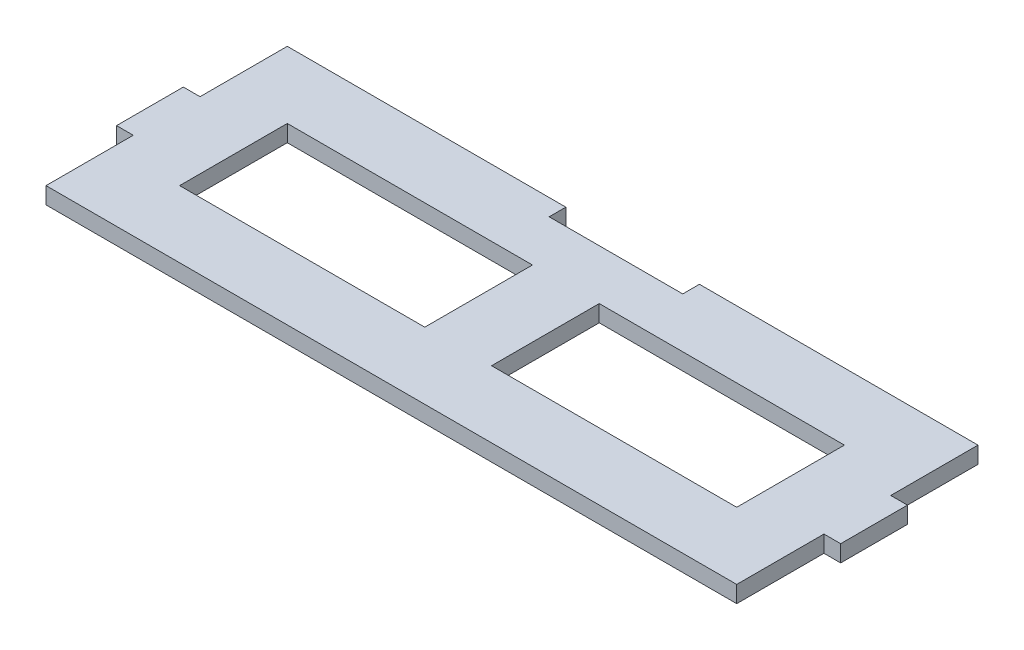
ISO-10303-21;
HEADER;
FILE_DESCRIPTION(('STEP AP214'),'2;1');
FILE_NAME('part.step','',(''),(''),'','','');
FILE_SCHEMA(('AUTOMOTIVE_DESIGN { 1 0 10303 214 1 1 1 1 }'));
ENDSEC;
DATA;
#1=APPLICATION_CONTEXT('core data for automotive mechanical design processes');
#2=APPLICATION_PROTOCOL_DEFINITION('international standard','automotive_design',2000,#1);
#3=PRODUCT_CONTEXT('',#1,'mechanical');
#4=PRODUCT('Part','Part','',(#3));
#5=PRODUCT_RELATED_PRODUCT_CATEGORY('part','',(#4));
#6=PRODUCT_DEFINITION_FORMATION('','',#4);
#7=PRODUCT_DEFINITION_CONTEXT('part definition',#1,'design');
#8=PRODUCT_DEFINITION('design','',#6,#7);
#9=PRODUCT_DEFINITION_SHAPE('','',#8);
#10=(LENGTH_UNIT() NAMED_UNIT(*) SI_UNIT(.MILLI.,.METRE.));
#11=(NAMED_UNIT(*) PLANE_ANGLE_UNIT() SI_UNIT($,.RADIAN.));
#12=(NAMED_UNIT(*) SI_UNIT($,.STERADIAN.) SOLID_ANGLE_UNIT());
#13=UNCERTAINTY_MEASURE_WITH_UNIT(LENGTH_MEASURE(1.E-05),#10,'distance_accuracy_value','');
#14=(GEOMETRIC_REPRESENTATION_CONTEXT(3) GLOBAL_UNCERTAINTY_ASSIGNED_CONTEXT((#13)) GLOBAL_UNIT_ASSIGNED_CONTEXT((#10,
#11,#12)) REPRESENTATION_CONTEXT('',''));
#15=CARTESIAN_POINT('',(0.,0.,0.));
#16=DIRECTION('',(0.,0.,1.));
#17=DIRECTION('',(1.,0.,0.));
#18=AXIS2_PLACEMENT_3D('',#15,#16,#17);
#19=CARTESIAN_POINT('',(0.,3.175,0.));
#20=DIRECTION('',(0.,-1.,0.));
#21=DIRECTION('',(0.,0.,-1.));
#22=AXIS2_PLACEMENT_3D('',#19,#20,#21);
#23=PLANE('',#22);
#24=DIRECTION('',(0.,0.,1.));
#25=VECTOR('',#24,1.);
#26=CARTESIAN_POINT('',(-52.959,3.175,-10.2362));
#27=LINE('',#26,#25);
#28=CARTESIAN_POINT('',(-52.959,3.175,-10.2362));
#29=VERTEX_POINT('',#28);
#30=CARTESIAN_POINT('',(-52.959,3.175,10.2362));
#31=VERTEX_POINT('',#30);
#32=EDGE_CURVE('E230',#29,#31,#27,.T.);
#33=ORIENTED_EDGE('',*,*,#32,.F.);
#34=DIRECTION('',(-1.,0.,0.));
#35=VECTOR('',#34,1.);
#36=CARTESIAN_POINT('',(-52.959,3.175,-10.2362));
#37=LINE('',#36,#35);
#38=CARTESIAN_POINT('',(-6.34999999999999,3.175,-10.2362));
#39=VERTEX_POINT('',#38);
#40=EDGE_CURVE('E238',#39,#29,#37,.T.);
#41=ORIENTED_EDGE('',*,*,#40,.F.);
#42=DIRECTION('',(0.,0.,-1.));
#43=VECTOR('',#42,1.);
#44=CARTESIAN_POINT('',(-6.34999999999999,3.175,-10.2362));
#45=LINE('',#44,#43);
#46=CARTESIAN_POINT('',(-6.34999999999999,3.175,10.2362));
#47=VERTEX_POINT('',#46);
#48=EDGE_CURVE('E235',#47,#39,#45,.T.);
#49=ORIENTED_EDGE('',*,*,#48,.F.);
#50=DIRECTION('',(1.,0.,0.));
#51=VECTOR('',#50,1.);
#52=CARTESIAN_POINT('',(-52.959,3.175,10.2362));
#53=LINE('',#52,#51);
#54=EDGE_CURVE('E232',#31,#47,#53,.T.);
#55=ORIENTED_EDGE('',*,*,#54,.F.);
#56=EDGE_LOOP('',(#33,#41,#49,#55));
#57=FACE_BOUND('',#56,.T.);
#58=DIRECTION('',(0.,0.,1.));
#59=VECTOR('',#58,1.);
#60=CARTESIAN_POINT('',(-65.659,3.175,-22.9362));
#61=LINE('',#60,#59);
#62=CARTESIAN_POINT('',(-65.659,3.175,-22.9362));
#63=VERTEX_POINT('',#62);
#64=CARTESIAN_POINT('',(-65.659,3.175,-6.35));
#65=VERTEX_POINT('',#64);
#66=EDGE_CURVE('E261',#63,#65,#61,.T.);
#67=ORIENTED_EDGE('',*,*,#66,.T.);
#68=DIRECTION('',(-1.,0.,0.));
#69=VECTOR('',#68,1.);
#70=CARTESIAN_POINT('',(-65.659,3.175,-6.35));
#71=LINE('',#70,#69);
#72=CARTESIAN_POINT('',(-68.834,3.175,-6.35));
#73=VERTEX_POINT('',#72);
#74=EDGE_CURVE('E264',#65,#73,#71,.T.);
#75=ORIENTED_EDGE('',*,*,#74,.T.);
#76=DIRECTION('',(0.,0.,1.));
#77=VECTOR('',#76,1.);
#78=CARTESIAN_POINT('',(-68.834,3.175,-6.35));
#79=LINE('',#78,#77);
#80=CARTESIAN_POINT('',(-68.834,3.175,6.35));
#81=VERTEX_POINT('',#80);
#82=EDGE_CURVE('E267',#73,#81,#79,.T.);
#83=ORIENTED_EDGE('',*,*,#82,.T.);
#84=DIRECTION('',(1.,0.,0.));
#85=VECTOR('',#84,1.);
#86=CARTESIAN_POINT('',(-68.834,3.175,6.35));
#87=LINE('',#86,#85);
#88=CARTESIAN_POINT('',(-65.659,3.175,6.35));
#89=VERTEX_POINT('',#88);
#90=EDGE_CURVE('E269',#81,#89,#87,.T.);
#91=ORIENTED_EDGE('',*,*,#90,.T.);
#92=DIRECTION('',(0.,0.,1.));
#93=VECTOR('',#92,1.);
#94=CARTESIAN_POINT('',(-65.659,3.175,6.35));
#95=LINE('',#94,#93);
#96=CARTESIAN_POINT('',(-65.659,3.175,22.9362));
#97=VERTEX_POINT('',#96);
#98=EDGE_CURVE('E271',#89,#97,#95,.T.);
#99=ORIENTED_EDGE('',*,*,#98,.T.);
#100=DIRECTION('',(1.,0.,0.));
#101=VECTOR('',#100,1.);
#102=CARTESIAN_POINT('',(-65.659,3.175,22.9362));
#103=LINE('',#102,#101);
#104=CARTESIAN_POINT('',(65.659,3.175,22.9362));
#105=VERTEX_POINT('',#104);
#106=EDGE_CURVE('E273',#97,#105,#103,.T.);
#107=ORIENTED_EDGE('',*,*,#106,.T.);
#108=DIRECTION('',(0.,0.,-1.));
#109=VECTOR('',#108,1.);
#110=CARTESIAN_POINT('',(65.659,3.175,6.35));
#111=LINE('',#110,#109);
#112=CARTESIAN_POINT('',(65.659,3.175,6.35));
#113=VERTEX_POINT('',#112);
#114=EDGE_CURVE('E275',#105,#113,#111,.T.);
#115=ORIENTED_EDGE('',*,*,#114,.T.);
#116=DIRECTION('',(1.,0.,0.));
#117=VECTOR('',#116,1.);
#118=CARTESIAN_POINT('',(68.834,3.175,6.35));
#119=LINE('',#118,#117);
#120=CARTESIAN_POINT('',(68.834,3.175,6.35));
#121=VERTEX_POINT('',#120);
#122=EDGE_CURVE('E277',#113,#121,#119,.T.);
#123=ORIENTED_EDGE('',*,*,#122,.T.);
#124=DIRECTION('',(0.,0.,-1.));
#125=VECTOR('',#124,1.);
#126=CARTESIAN_POINT('',(68.834,3.175,-6.35));
#127=LINE('',#126,#125);
#128=CARTESIAN_POINT('',(68.834,3.175,-6.35));
#129=VERTEX_POINT('',#128);
#130=EDGE_CURVE('E279',#121,#129,#127,.T.);
#131=ORIENTED_EDGE('',*,*,#130,.T.);
#132=DIRECTION('',(-1.,0.,0.));
#133=VECTOR('',#132,1.);
#134=CARTESIAN_POINT('',(65.659,3.175,-6.35));
#135=LINE('',#134,#133);
#136=CARTESIAN_POINT('',(65.659,3.175,-6.35));
#137=VERTEX_POINT('',#136);
#138=EDGE_CURVE('E281',#129,#137,#135,.T.);
#139=ORIENTED_EDGE('',*,*,#138,.T.);
#140=DIRECTION('',(0.,0.,-1.));
#141=VECTOR('',#140,1.);
#142=CARTESIAN_POINT('',(65.659,3.175,-22.9362));
#143=LINE('',#142,#141);
#144=CARTESIAN_POINT('',(65.659,3.175,-22.9362));
#145=VERTEX_POINT('',#144);
#146=EDGE_CURVE('E283',#137,#145,#143,.T.);
#147=ORIENTED_EDGE('',*,*,#146,.T.);
#148=DIRECTION('',(-1.,0.,0.));
#149=VECTOR('',#148,1.);
#150=CARTESIAN_POINT('',(12.7,3.175,-22.9362));
#151=LINE('',#150,#149);
#152=CARTESIAN_POINT('',(12.7,3.175,-22.9362));
#153=VERTEX_POINT('',#152);
#154=EDGE_CURVE('E285',#145,#153,#151,.T.);
#155=ORIENTED_EDGE('',*,*,#154,.T.);
#156=DIRECTION('',(0.,0.,1.));
#157=VECTOR('',#156,1.);
#158=CARTESIAN_POINT('',(12.7,3.175,-19.7612));
#159=LINE('',#158,#157);
#160=CARTESIAN_POINT('',(12.7,3.175,-19.7612));
#161=VERTEX_POINT('',#160);
#162=EDGE_CURVE('E287',#153,#161,#159,.T.);
#163=ORIENTED_EDGE('',*,*,#162,.T.);
#164=DIRECTION('',(-1.,0.,0.));
#165=VECTOR('',#164,1.);
#166=CARTESIAN_POINT('',(-12.7,3.175,-19.7612));
#167=LINE('',#166,#165);
#168=CARTESIAN_POINT('',(-12.7,3.175,-19.7612));
#169=VERTEX_POINT('',#168);
#170=EDGE_CURVE('E289',#161,#169,#167,.T.);
#171=ORIENTED_EDGE('',*,*,#170,.T.);
#172=DIRECTION('',(0.,0.,-1.));
#173=VECTOR('',#172,1.);
#174=CARTESIAN_POINT('',(-12.7,3.175,-22.9362));
#175=LINE('',#174,#173);
#176=CARTESIAN_POINT('',(-12.7,3.175,-22.9362));
#177=VERTEX_POINT('',#176);
#178=EDGE_CURVE('E291',#169,#177,#175,.T.);
#179=ORIENTED_EDGE('',*,*,#178,.T.);
#180=DIRECTION('',(-1.,0.,0.));
#181=VECTOR('',#180,1.);
#182=CARTESIAN_POINT('',(-65.659,3.175,-22.9362));
#183=LINE('',#182,#181);
#184=EDGE_CURVE('E293',#177,#63,#183,.T.);
#185=ORIENTED_EDGE('',*,*,#184,.T.);
#186=EDGE_LOOP('',(#67,#75,#83,#91,#99,#107,#115,#123,#131,#139,#147,#155,#163,#171,#179,#185));
#187=FACE_BOUND('',#186,.T.);
#188=DIRECTION('',(1.,0.,0.));
#189=VECTOR('',#188,1.);
#190=CARTESIAN_POINT('',(6.35000000000001,3.175,10.2362));
#191=LINE('',#190,#189);
#192=CARTESIAN_POINT('',(6.35000000000001,3.175,10.2362));
#193=VERTEX_POINT('',#192);
#194=CARTESIAN_POINT('',(52.959,3.175,10.2362));
#195=VERTEX_POINT('',#194);
#196=EDGE_CURVE('E194',#193,#195,#191,.T.);
#197=ORIENTED_EDGE('',*,*,#196,.F.);
#198=DIRECTION('',(0.,0.,1.));
#199=VECTOR('',#198,1.);
#200=CARTESIAN_POINT('',(6.35000000000001,3.175,-10.2362));
#201=LINE('',#200,#199);
#202=CARTESIAN_POINT('',(6.35000000000001,3.175,-10.2362));
#203=VERTEX_POINT('',#202);
#204=EDGE_CURVE('E216',#203,#193,#201,.T.);
#205=ORIENTED_EDGE('',*,*,#204,.F.);
#206=DIRECTION('',(-1.,0.,0.));
#207=VECTOR('',#206,1.);
#208=CARTESIAN_POINT('',(6.35000000000001,3.175,-10.2362));
#209=LINE('',#208,#207);
#210=CARTESIAN_POINT('',(52.959,3.175,-10.2362));
#211=VERTEX_POINT('',#210);
#212=EDGE_CURVE('E214',#211,#203,#209,.T.);
#213=ORIENTED_EDGE('',*,*,#212,.F.);
#214=DIRECTION('',(0.,0.,-1.));
#215=VECTOR('',#214,1.);
#216=CARTESIAN_POINT('',(52.959,3.175,-10.2362));
#217=LINE('',#216,#215);
#218=EDGE_CURVE('E202',#195,#211,#217,.T.);
#219=ORIENTED_EDGE('',*,*,#218,.F.);
#220=EDGE_LOOP('',(#197,#205,#213,#219));
#221=FACE_BOUND('',#220,.T.);
#222=ADVANCED_FACE('F33',(#57,#187,#221),#23,.F.);
#223=CARTESIAN_POINT('',(0.,0.,0.));
#224=DIRECTION('',(0.,-1.,0.));
#225=DIRECTION('',(0.,0.,-1.));
#226=AXIS2_PLACEMENT_3D('',#223,#224,#225);
#227=PLANE('',#226);
#228=DIRECTION('',(0.,0.,1.));
#229=VECTOR('',#228,1.);
#230=CARTESIAN_POINT('',(-65.659,0.,-22.9362));
#231=LINE('',#230,#229);
#232=CARTESIAN_POINT('',(-65.659,0.,-22.9362));
#233=VERTEX_POINT('',#232);
#234=CARTESIAN_POINT('',(-65.659,0.,-6.35));
#235=VERTEX_POINT('',#234);
#236=EDGE_CURVE('E260',#233,#235,#231,.T.);
#237=ORIENTED_EDGE('',*,*,#236,.F.);
#238=DIRECTION('',(-1.,0.,0.));
#239=VECTOR('',#238,1.);
#240=CARTESIAN_POINT('',(-65.659,0.,-22.9362));
#241=LINE('',#240,#239);
#242=CARTESIAN_POINT('',(-12.7,0.,-22.9362));
#243=VERTEX_POINT('',#242);
#244=EDGE_CURVE('E265',#243,#233,#241,.T.);
#245=ORIENTED_EDGE('',*,*,#244,.F.);
#246=DIRECTION('',(0.,0.,-1.));
#247=VECTOR('',#246,1.);
#248=CARTESIAN_POINT('',(-12.7,0.,-22.9362));
#249=LINE('',#248,#247);
#250=CARTESIAN_POINT('',(-12.7,0.,-19.7612));
#251=VERTEX_POINT('',#250);
#252=EDGE_CURVE('E324',#251,#243,#249,.T.);
#253=ORIENTED_EDGE('',*,*,#252,.F.);
#254=DIRECTION('',(-1.,0.,0.));
#255=VECTOR('',#254,1.);
#256=CARTESIAN_POINT('',(-12.7,0.,-19.7612));
#257=LINE('',#256,#255);
#258=CARTESIAN_POINT('',(12.7,0.,-19.7612));
#259=VERTEX_POINT('',#258);
#260=EDGE_CURVE('E322',#259,#251,#257,.T.);
#261=ORIENTED_EDGE('',*,*,#260,.F.);
#262=DIRECTION('',(0.,0.,1.));
#263=VECTOR('',#262,1.);
#264=CARTESIAN_POINT('',(12.7,0.,-19.7612));
#265=LINE('',#264,#263);
#266=CARTESIAN_POINT('',(12.7,0.,-22.9362));
#267=VERTEX_POINT('',#266);
#268=EDGE_CURVE('E320',#267,#259,#265,.T.);
#269=ORIENTED_EDGE('',*,*,#268,.F.);
#270=DIRECTION('',(-1.,0.,0.));
#271=VECTOR('',#270,1.);
#272=CARTESIAN_POINT('',(12.7,0.,-22.9362));
#273=LINE('',#272,#271);
#274=CARTESIAN_POINT('',(65.659,0.,-22.9362));
#275=VERTEX_POINT('',#274);
#276=EDGE_CURVE('E318',#275,#267,#273,.T.);
#277=ORIENTED_EDGE('',*,*,#276,.F.);
#278=DIRECTION('',(0.,0.,-1.));
#279=VECTOR('',#278,1.);
#280=CARTESIAN_POINT('',(65.659,0.,-22.9362));
#281=LINE('',#280,#279);
#282=CARTESIAN_POINT('',(65.659,0.,-6.35));
#283=VERTEX_POINT('',#282);
#284=EDGE_CURVE('E316',#283,#275,#281,.T.);
#285=ORIENTED_EDGE('',*,*,#284,.F.);
#286=DIRECTION('',(-1.,0.,0.));
#287=VECTOR('',#286,1.);
#288=CARTESIAN_POINT('',(65.659,0.,-6.35));
#289=LINE('',#288,#287);
#290=CARTESIAN_POINT('',(68.834,0.,-6.35));
#291=VERTEX_POINT('',#290);
#292=EDGE_CURVE('E314',#291,#283,#289,.T.);
#293=ORIENTED_EDGE('',*,*,#292,.F.);
#294=DIRECTION('',(0.,0.,-1.));
#295=VECTOR('',#294,1.);
#296=CARTESIAN_POINT('',(68.834,0.,-6.35));
#297=LINE('',#296,#295);
#298=CARTESIAN_POINT('',(68.834,0.,6.35));
#299=VERTEX_POINT('',#298);
#300=EDGE_CURVE('E312',#299,#291,#297,.T.);
#301=ORIENTED_EDGE('',*,*,#300,.F.);
#302=DIRECTION('',(1.,0.,0.));
#303=VECTOR('',#302,1.);
#304=CARTESIAN_POINT('',(68.834,0.,6.35));
#305=LINE('',#304,#303);
#306=CARTESIAN_POINT('',(65.659,0.,6.35));
#307=VERTEX_POINT('',#306);
#308=EDGE_CURVE('E310',#307,#299,#305,.T.);
#309=ORIENTED_EDGE('',*,*,#308,.F.);
#310=DIRECTION('',(0.,0.,-1.));
#311=VECTOR('',#310,1.);
#312=CARTESIAN_POINT('',(65.659,0.,6.35));
#313=LINE('',#312,#311);
#314=CARTESIAN_POINT('',(65.659,0.,22.9362));
#315=VERTEX_POINT('',#314);
#316=EDGE_CURVE('E308',#315,#307,#313,.T.);
#317=ORIENTED_EDGE('',*,*,#316,.F.);
#318=DIRECTION('',(1.,0.,0.));
#319=VECTOR('',#318,1.);
#320=CARTESIAN_POINT('',(-65.659,0.,22.9362));
#321=LINE('',#320,#319);
#322=CARTESIAN_POINT('',(-65.659,0.,22.9362));
#323=VERTEX_POINT('',#322);
#324=EDGE_CURVE('E306',#323,#315,#321,.T.);
#325=ORIENTED_EDGE('',*,*,#324,.F.);
#326=DIRECTION('',(0.,0.,1.));
#327=VECTOR('',#326,1.);
#328=CARTESIAN_POINT('',(-65.659,0.,6.35));
#329=LINE('',#328,#327);
#330=CARTESIAN_POINT('',(-65.659,0.,6.35));
#331=VERTEX_POINT('',#330);
#332=EDGE_CURVE('E304',#331,#323,#329,.T.);
#333=ORIENTED_EDGE('',*,*,#332,.F.);
#334=DIRECTION('',(1.,0.,0.));
#335=VECTOR('',#334,1.);
#336=CARTESIAN_POINT('',(-68.834,0.,6.35));
#337=LINE('',#336,#335);
#338=CARTESIAN_POINT('',(-68.834,0.,6.35));
#339=VERTEX_POINT('',#338);
#340=EDGE_CURVE('E302',#339,#331,#337,.T.);
#341=ORIENTED_EDGE('',*,*,#340,.F.);
#342=DIRECTION('',(0.,0.,1.));
#343=VECTOR('',#342,1.);
#344=CARTESIAN_POINT('',(-68.834,0.,-6.35));
#345=LINE('',#344,#343);
#346=CARTESIAN_POINT('',(-68.834,0.,-6.35));
#347=VERTEX_POINT('',#346);
#348=EDGE_CURVE('E300',#347,#339,#345,.T.);
#349=ORIENTED_EDGE('',*,*,#348,.F.);
#350=DIRECTION('',(-1.,0.,0.));
#351=VECTOR('',#350,1.);
#352=CARTESIAN_POINT('',(-65.659,0.,-6.35));
#353=LINE('',#352,#351);
#354=EDGE_CURVE('E298',#235,#347,#353,.T.);
#355=ORIENTED_EDGE('',*,*,#354,.F.);
#356=EDGE_LOOP('',(#237,#245,#253,#261,#269,#277,#285,#293,#301,#309,#317,#325,#333,#341,#349,#355));
#357=FACE_BOUND('',#356,.T.);
#358=DIRECTION('',(-1.,0.,0.));
#359=VECTOR('',#358,1.);
#360=CARTESIAN_POINT('',(-52.959,0.,-10.2362));
#361=LINE('',#360,#359);
#362=CARTESIAN_POINT('',(-6.34999999999999,0.,-10.2362));
#363=VERTEX_POINT('',#362);
#364=CARTESIAN_POINT('',(-52.959,0.,-10.2362));
#365=VERTEX_POINT('',#364);
#366=EDGE_CURVE('E233',#363,#365,#361,.T.);
#367=ORIENTED_EDGE('',*,*,#366,.T.);
#368=DIRECTION('',(0.,0.,1.));
#369=VECTOR('',#368,1.);
#370=CARTESIAN_POINT('',(-52.959,0.,-10.2362));
#371=LINE('',#370,#369);
#372=CARTESIAN_POINT('',(-52.959,0.,10.2362));
#373=VERTEX_POINT('',#372);
#374=EDGE_CURVE('E210',#365,#373,#371,.T.);
#375=ORIENTED_EDGE('',*,*,#374,.T.);
#376=DIRECTION('',(1.,0.,0.));
#377=VECTOR('',#376,1.);
#378=CARTESIAN_POINT('',(-52.959,0.,10.2362));
#379=LINE('',#378,#377);
#380=CARTESIAN_POINT('',(-6.34999999999999,0.,10.2362));
#381=VERTEX_POINT('',#380);
#382=EDGE_CURVE('E243',#373,#381,#379,.T.);
#383=ORIENTED_EDGE('',*,*,#382,.T.);
#384=DIRECTION('',(0.,0.,-1.));
#385=VECTOR('',#384,1.);
#386=CARTESIAN_POINT('',(-6.34999999999999,0.,-10.2362));
#387=LINE('',#386,#385);
#388=EDGE_CURVE('E246',#381,#363,#387,.T.);
#389=ORIENTED_EDGE('',*,*,#388,.T.);
#390=EDGE_LOOP('',(#367,#375,#383,#389));
#391=FACE_BOUND('',#390,.T.);
#392=DIRECTION('',(0.,0.,1.));
#393=VECTOR('',#392,1.);
#394=CARTESIAN_POINT('',(6.35000000000001,0.,-10.2362));
#395=LINE('',#394,#393);
#396=CARTESIAN_POINT('',(6.35000000000001,0.,-10.2362));
#397=VERTEX_POINT('',#396);
#398=CARTESIAN_POINT('',(6.35000000000001,0.,10.2362));
#399=VERTEX_POINT('',#398);
#400=EDGE_CURVE('E203',#397,#399,#395,.T.);
#401=ORIENTED_EDGE('',*,*,#400,.T.);
#402=DIRECTION('',(1.,0.,0.));
#403=VECTOR('',#402,1.);
#404=CARTESIAN_POINT('',(6.35000000000001,0.,10.2362));
#405=LINE('',#404,#403);
#406=CARTESIAN_POINT('',(52.959,0.,10.2362));
#407=VERTEX_POINT('',#406);
#408=EDGE_CURVE('E56',#399,#407,#405,.T.);
#409=ORIENTED_EDGE('',*,*,#408,.T.);
#410=DIRECTION('',(0.,0.,-1.));
#411=VECTOR('',#410,1.);
#412=CARTESIAN_POINT('',(52.959,0.,-10.2362));
#413=LINE('',#412,#411);
#414=CARTESIAN_POINT('',(52.959,0.,-10.2362));
#415=VERTEX_POINT('',#414);
#416=EDGE_CURVE('E209',#407,#415,#413,.T.);
#417=ORIENTED_EDGE('',*,*,#416,.T.);
#418=DIRECTION('',(-1.,0.,0.));
#419=VECTOR('',#418,1.);
#420=CARTESIAN_POINT('',(6.35000000000001,0.,-10.2362));
#421=LINE('',#420,#419);
#422=EDGE_CURVE('E222',#415,#397,#421,.T.);
#423=ORIENTED_EDGE('',*,*,#422,.T.);
#424=EDGE_LOOP('',(#401,#409,#417,#423));
#425=FACE_BOUND('',#424,.T.);
#426=ADVANCED_FACE('F378',(#357,#391,#425),#227,.T.);
#427=CARTESIAN_POINT('',(-65.659,3.175,-22.9362));
#428=DIRECTION('',(1.,0.,0.));
#429=DIRECTION('',(0.,0.,-1.));
#430=AXIS2_PLACEMENT_3D('',#427,#428,#429);
#431=PLANE('',#430);
#432=ORIENTED_EDGE('',*,*,#236,.T.);
#433=DIRECTION('',(0.,-1.,0.));
#434=VECTOR('',#433,1.);
#435=CARTESIAN_POINT('',(-65.659,3.175,-6.35));
#436=LINE('',#435,#434);
#437=EDGE_CURVE('E11',#65,#235,#436,.T.);
#438=ORIENTED_EDGE('',*,*,#437,.F.);
#439=ORIENTED_EDGE('',*,*,#66,.F.);
#440=DIRECTION('',(0.,-1.,0.));
#441=VECTOR('',#440,1.);
#442=CARTESIAN_POINT('',(-65.659,3.175,-22.9362));
#443=LINE('',#442,#441);
#444=EDGE_CURVE('E295',#63,#233,#443,.T.);
#445=ORIENTED_EDGE('',*,*,#444,.T.);
#446=EDGE_LOOP('',(#432,#438,#439,#445));
#447=FACE_BOUND('',#446,.T.);
#448=ADVANCED_FACE('F35',(#447),#431,.F.);
#449=CARTESIAN_POINT('',(-65.659,3.175,-6.35));
#450=DIRECTION('',(0.,0.,1.));
#451=DIRECTION('',(1.,0.,0.));
#452=AXIS2_PLACEMENT_3D('',#449,#450,#451);
#453=PLANE('',#452);
#454=ORIENTED_EDGE('',*,*,#354,.T.);
#455=DIRECTION('',(0.,-1.,0.));
#456=VECTOR('',#455,1.);
#457=CARTESIAN_POINT('',(-68.834,3.175,-6.35));
#458=LINE('',#457,#456);
#459=EDGE_CURVE('E41',#73,#347,#458,.T.);
#460=ORIENTED_EDGE('',*,*,#459,.F.);
#461=ORIENTED_EDGE('',*,*,#74,.F.);
#462=ORIENTED_EDGE('',*,*,#437,.T.);
#463=EDGE_LOOP('',(#454,#460,#461,#462));
#464=FACE_BOUND('',#463,.T.);
#465=ADVANCED_FACE('F395',(#464),#453,.F.);
#466=CARTESIAN_POINT('',(-68.834,3.175,-6.35));
#467=DIRECTION('',(1.,0.,0.));
#468=DIRECTION('',(0.,0.,-1.));
#469=AXIS2_PLACEMENT_3D('',#466,#467,#468);
#470=PLANE('',#469);
#471=ORIENTED_EDGE('',*,*,#348,.T.);
#472=DIRECTION('',(0.,-1.,0.));
#473=VECTOR('',#472,1.);
#474=CARTESIAN_POINT('',(-68.834,3.175,6.35));
#475=LINE('',#474,#473);
#476=EDGE_CURVE('E365',#81,#339,#475,.T.);
#477=ORIENTED_EDGE('',*,*,#476,.F.);
#478=ORIENTED_EDGE('',*,*,#82,.F.);
#479=ORIENTED_EDGE('',*,*,#459,.T.);
#480=EDGE_LOOP('',(#471,#477,#478,#479));
#481=FACE_BOUND('',#480,.T.);
#482=ADVANCED_FACE('F372',(#481),#470,.F.);
#483=CARTESIAN_POINT('',(-68.834,3.175,6.35));
#484=DIRECTION('',(0.,0.,-1.));
#485=DIRECTION('',(-1.,0.,0.));
#486=AXIS2_PLACEMENT_3D('',#483,#484,#485);
#487=PLANE('',#486);
#488=ORIENTED_EDGE('',*,*,#340,.T.);
#489=DIRECTION('',(0.,-1.,0.));
#490=VECTOR('',#489,1.);
#491=CARTESIAN_POINT('',(-65.659,3.175,6.35));
#492=LINE('',#491,#490);
#493=EDGE_CURVE('E362',#89,#331,#492,.T.);
#494=ORIENTED_EDGE('',*,*,#493,.F.);
#495=ORIENTED_EDGE('',*,*,#90,.F.);
#496=ORIENTED_EDGE('',*,*,#476,.T.);
#497=EDGE_LOOP('',(#488,#494,#495,#496));
#498=FACE_BOUND('',#497,.T.);
#499=ADVANCED_FACE('F384',(#498),#487,.F.);
#500=CARTESIAN_POINT('',(-65.659,3.175,6.35));
#501=DIRECTION('',(1.,0.,0.));
#502=DIRECTION('',(0.,0.,-1.));
#503=AXIS2_PLACEMENT_3D('',#500,#501,#502);
#504=PLANE('',#503);
#505=ORIENTED_EDGE('',*,*,#332,.T.);
#506=DIRECTION('',(0.,-1.,0.));
#507=VECTOR('',#506,1.);
#508=CARTESIAN_POINT('',(-65.659,3.175,22.9362));
#509=LINE('',#508,#507);
#510=EDGE_CURVE('E359',#97,#323,#509,.T.);
#511=ORIENTED_EDGE('',*,*,#510,.F.);
#512=ORIENTED_EDGE('',*,*,#98,.F.);
#513=ORIENTED_EDGE('',*,*,#493,.T.);
#514=EDGE_LOOP('',(#505,#511,#512,#513));
#515=FACE_BOUND('',#514,.T.);
#516=ADVANCED_FACE('F388',(#515),#504,.F.);
#517=CARTESIAN_POINT('',(-65.659,3.175,22.9362));
#518=DIRECTION('',(0.,0.,-1.));
#519=DIRECTION('',(-1.,0.,0.));
#520=AXIS2_PLACEMENT_3D('',#517,#518,#519);
#521=PLANE('',#520);
#522=ORIENTED_EDGE('',*,*,#324,.T.);
#523=DIRECTION('',(0.,-1.,0.));
#524=VECTOR('',#523,1.);
#525=CARTESIAN_POINT('',(65.659,3.175,22.9362));
#526=LINE('',#525,#524);
#527=EDGE_CURVE('E356',#105,#315,#526,.T.);
#528=ORIENTED_EDGE('',*,*,#527,.F.);
#529=ORIENTED_EDGE('',*,*,#106,.F.);
#530=ORIENTED_EDGE('',*,*,#510,.T.);
#531=EDGE_LOOP('',(#522,#528,#529,#530));
#532=FACE_BOUND('',#531,.T.);
#533=ADVANCED_FACE('F448',(#532),#521,.F.);
#534=CARTESIAN_POINT('',(65.659,3.175,6.35));
#535=DIRECTION('',(-1.,0.,0.));
#536=DIRECTION('',(0.,0.,1.));
#537=AXIS2_PLACEMENT_3D('',#534,#535,#536);
#538=PLANE('',#537);
#539=ORIENTED_EDGE('',*,*,#316,.T.);
#540=DIRECTION('',(0.,-1.,0.));
#541=VECTOR('',#540,1.);
#542=CARTESIAN_POINT('',(65.659,3.175,6.35));
#543=LINE('',#542,#541);
#544=EDGE_CURVE('E353',#113,#307,#543,.T.);
#545=ORIENTED_EDGE('',*,*,#544,.F.);
#546=ORIENTED_EDGE('',*,*,#114,.F.);
#547=ORIENTED_EDGE('',*,*,#527,.T.);
#548=EDGE_LOOP('',(#539,#545,#546,#547));
#549=FACE_BOUND('',#548,.T.);
#550=ADVANCED_FACE('F445',(#549),#538,.F.);
#551=CARTESIAN_POINT('',(68.834,3.175,6.35));
#552=DIRECTION('',(0.,0.,-1.));
#553=DIRECTION('',(-1.,0.,0.));
#554=AXIS2_PLACEMENT_3D('',#551,#552,#553);
#555=PLANE('',#554);
#556=ORIENTED_EDGE('',*,*,#308,.T.);
#557=DIRECTION('',(0.,-1.,0.));
#558=VECTOR('',#557,1.);
#559=CARTESIAN_POINT('',(68.834,3.175,6.35));
#560=LINE('',#559,#558);
#561=EDGE_CURVE('E350',#121,#299,#560,.T.);
#562=ORIENTED_EDGE('',*,*,#561,.F.);
#563=ORIENTED_EDGE('',*,*,#122,.F.);
#564=ORIENTED_EDGE('',*,*,#544,.T.);
#565=EDGE_LOOP('',(#556,#562,#563,#564));
#566=FACE_BOUND('',#565,.T.);
#567=ADVANCED_FACE('F441',(#566),#555,.F.);
#568=CARTESIAN_POINT('',(68.834,3.175,-6.35));
#569=DIRECTION('',(-1.,0.,0.));
#570=DIRECTION('',(0.,0.,1.));
#571=AXIS2_PLACEMENT_3D('',#568,#569,#570);
#572=PLANE('',#571);
#573=ORIENTED_EDGE('',*,*,#300,.T.);
#574=DIRECTION('',(0.,-1.,0.));
#575=VECTOR('',#574,1.);
#576=CARTESIAN_POINT('',(68.834,3.175,-6.35));
#577=LINE('',#576,#575);
#578=EDGE_CURVE('E347',#129,#291,#577,.T.);
#579=ORIENTED_EDGE('',*,*,#578,.F.);
#580=ORIENTED_EDGE('',*,*,#130,.F.);
#581=ORIENTED_EDGE('',*,*,#561,.T.);
#582=EDGE_LOOP('',(#573,#579,#580,#581));
#583=FACE_BOUND('',#582,.T.);
#584=ADVANCED_FACE('F437',(#583),#572,.F.);
#585=CARTESIAN_POINT('',(65.659,3.175,-6.35));
#586=DIRECTION('',(0.,0.,1.));
#587=DIRECTION('',(1.,0.,0.));
#588=AXIS2_PLACEMENT_3D('',#585,#586,#587);
#589=PLANE('',#588);
#590=ORIENTED_EDGE('',*,*,#292,.T.);
#591=DIRECTION('',(0.,-1.,0.));
#592=VECTOR('',#591,1.);
#593=CARTESIAN_POINT('',(65.659,3.175,-6.35));
#594=LINE('',#593,#592);
#595=EDGE_CURVE('E344',#137,#283,#594,.T.);
#596=ORIENTED_EDGE('',*,*,#595,.F.);
#597=ORIENTED_EDGE('',*,*,#138,.F.);
#598=ORIENTED_EDGE('',*,*,#578,.T.);
#599=EDGE_LOOP('',(#590,#596,#597,#598));
#600=FACE_BOUND('',#599,.T.);
#601=ADVANCED_FACE('F432',(#600),#589,.F.);
#602=CARTESIAN_POINT('',(65.659,3.175,-22.9362));
#603=DIRECTION('',(-1.,0.,0.));
#604=DIRECTION('',(0.,0.,1.));
#605=AXIS2_PLACEMENT_3D('',#602,#603,#604);
#606=PLANE('',#605);
#607=ORIENTED_EDGE('',*,*,#284,.T.);
#608=DIRECTION('',(0.,-1.,0.));
#609=VECTOR('',#608,1.);
#610=CARTESIAN_POINT('',(65.659,3.175,-22.9362));
#611=LINE('',#610,#609);
#612=EDGE_CURVE('E341',#145,#275,#611,.T.);
#613=ORIENTED_EDGE('',*,*,#612,.F.);
#614=ORIENTED_EDGE('',*,*,#146,.F.);
#615=ORIENTED_EDGE('',*,*,#595,.T.);
#616=EDGE_LOOP('',(#607,#613,#614,#615));
#617=FACE_BOUND('',#616,.T.);
#618=ADVANCED_FACE('F426',(#617),#606,.F.);
#619=CARTESIAN_POINT('',(12.7,3.175,-22.9362));
#620=DIRECTION('',(0.,0.,1.));
#621=DIRECTION('',(1.,0.,0.));
#622=AXIS2_PLACEMENT_3D('',#619,#620,#621);
#623=PLANE('',#622);
#624=ORIENTED_EDGE('',*,*,#276,.T.);
#625=DIRECTION('',(0.,-1.,0.));
#626=VECTOR('',#625,1.);
#627=CARTESIAN_POINT('',(12.7,3.175,-22.9362));
#628=LINE('',#627,#626);
#629=EDGE_CURVE('E338',#153,#267,#628,.T.);
#630=ORIENTED_EDGE('',*,*,#629,.F.);
#631=ORIENTED_EDGE('',*,*,#154,.F.);
#632=ORIENTED_EDGE('',*,*,#612,.T.);
#633=EDGE_LOOP('',(#624,#630,#631,#632));
#634=FACE_BOUND('',#633,.T.);
#635=ADVANCED_FACE('F422',(#634),#623,.F.);
#636=CARTESIAN_POINT('',(12.7,3.175,-19.7612));
#637=DIRECTION('',(1.,0.,0.));
#638=DIRECTION('',(0.,0.,-1.));
#639=AXIS2_PLACEMENT_3D('',#636,#637,#638);
#640=PLANE('',#639);
#641=ORIENTED_EDGE('',*,*,#268,.T.);
#642=DIRECTION('',(0.,-1.,0.));
#643=VECTOR('',#642,1.);
#644=CARTESIAN_POINT('',(12.7,3.175,-19.7612));
#645=LINE('',#644,#643);
#646=EDGE_CURVE('E335',#161,#259,#645,.T.);
#647=ORIENTED_EDGE('',*,*,#646,.F.);
#648=ORIENTED_EDGE('',*,*,#162,.F.);
#649=ORIENTED_EDGE('',*,*,#629,.T.);
#650=EDGE_LOOP('',(#641,#647,#648,#649));
#651=FACE_BOUND('',#650,.T.);
#652=ADVANCED_FACE('F417',(#651),#640,.F.);
#653=CARTESIAN_POINT('',(-12.7,3.175,-19.7612));
#654=DIRECTION('',(0.,0.,1.));
#655=DIRECTION('',(1.,0.,0.));
#656=AXIS2_PLACEMENT_3D('',#653,#654,#655);
#657=PLANE('',#656);
#658=ORIENTED_EDGE('',*,*,#260,.T.);
#659=DIRECTION('',(0.,-1.,0.));
#660=VECTOR('',#659,1.);
#661=CARTESIAN_POINT('',(-12.7,3.175,-19.7612));
#662=LINE('',#661,#660);
#663=EDGE_CURVE('E332',#169,#251,#662,.T.);
#664=ORIENTED_EDGE('',*,*,#663,.F.);
#665=ORIENTED_EDGE('',*,*,#170,.F.);
#666=ORIENTED_EDGE('',*,*,#646,.T.);
#667=EDGE_LOOP('',(#658,#664,#665,#666));
#668=FACE_BOUND('',#667,.T.);
#669=ADVANCED_FACE('F411',(#668),#657,.F.);
#670=CARTESIAN_POINT('',(-12.7,3.175,-22.9362));
#671=DIRECTION('',(-1.,0.,0.));
#672=DIRECTION('',(0.,0.,1.));
#673=AXIS2_PLACEMENT_3D('',#670,#671,#672);
#674=PLANE('',#673);
#675=ORIENTED_EDGE('',*,*,#252,.T.);
#676=DIRECTION('',(0.,-1.,0.));
#677=VECTOR('',#676,1.);
#678=CARTESIAN_POINT('',(-12.7,3.175,-22.9362));
#679=LINE('',#678,#677);
#680=EDGE_CURVE('E329',#177,#243,#679,.T.);
#681=ORIENTED_EDGE('',*,*,#680,.F.);
#682=ORIENTED_EDGE('',*,*,#178,.F.);
#683=ORIENTED_EDGE('',*,*,#663,.T.);
#684=EDGE_LOOP('',(#675,#681,#682,#683));
#685=FACE_BOUND('',#684,.T.);
#686=ADVANCED_FACE('F407',(#685),#674,.F.);
#687=CARTESIAN_POINT('',(-65.659,3.175,-22.9362));
#688=DIRECTION('',(0.,0.,1.));
#689=DIRECTION('',(1.,0.,0.));
#690=AXIS2_PLACEMENT_3D('',#687,#688,#689);
#691=PLANE('',#690);
#692=ORIENTED_EDGE('',*,*,#244,.T.);
#693=ORIENTED_EDGE('',*,*,#444,.F.);
#694=ORIENTED_EDGE('',*,*,#184,.F.);
#695=ORIENTED_EDGE('',*,*,#680,.T.);
#696=EDGE_LOOP('',(#692,#693,#694,#695));
#697=FACE_BOUND('',#696,.T.);
#698=ADVANCED_FACE('F402',(#697),#691,.F.);
#699=CARTESIAN_POINT('',(-52.959,3.175,-10.2362));
#700=DIRECTION('',(1.,0.,0.));
#701=DIRECTION('',(0.,0.,-1.));
#702=AXIS2_PLACEMENT_3D('',#699,#700,#701);
#703=PLANE('',#702);
#704=ORIENTED_EDGE('',*,*,#374,.F.);
#705=DIRECTION('',(0.,-1.,0.));
#706=VECTOR('',#705,1.);
#707=CARTESIAN_POINT('',(-52.959,3.175,-10.2362));
#708=LINE('',#707,#706);
#709=EDGE_CURVE('E240',#29,#365,#708,.T.);
#710=ORIENTED_EDGE('',*,*,#709,.F.);
#711=ORIENTED_EDGE('',*,*,#32,.T.);
#712=DIRECTION('',(0.,-1.,0.));
#713=VECTOR('',#712,1.);
#714=CARTESIAN_POINT('',(-52.959,3.175,10.2362));
#715=LINE('',#714,#713);
#716=EDGE_CURVE('E257',#31,#373,#715,.T.);
#717=ORIENTED_EDGE('',*,*,#716,.T.);
#718=EDGE_LOOP('',(#704,#710,#711,#717));
#719=FACE_BOUND('',#718,.T.);
#720=ADVANCED_FACE('F466',(#719),#703,.T.);
#721=CARTESIAN_POINT('',(-52.959,3.175,10.2362));
#722=DIRECTION('',(0.,0.,-1.));
#723=DIRECTION('',(-1.,0.,0.));
#724=AXIS2_PLACEMENT_3D('',#721,#722,#723);
#725=PLANE('',#724);
#726=ORIENTED_EDGE('',*,*,#382,.F.);
#727=ORIENTED_EDGE('',*,*,#716,.F.);
#728=ORIENTED_EDGE('',*,*,#54,.T.);
#729=DIRECTION('',(0.,-1.,0.));
#730=VECTOR('',#729,1.);
#731=CARTESIAN_POINT('',(-6.34999999999999,3.175,10.2362));
#732=LINE('',#731,#730);
#733=EDGE_CURVE('E255',#47,#381,#732,.T.);
#734=ORIENTED_EDGE('',*,*,#733,.T.);
#735=EDGE_LOOP('',(#726,#727,#728,#734));
#736=FACE_BOUND('',#735,.T.);
#737=ADVANCED_FACE('F528',(#736),#725,.T.);
#738=CARTESIAN_POINT('',(-6.34999999999999,3.175,-10.2362));
#739=DIRECTION('',(-1.,0.,0.));
#740=DIRECTION('',(0.,0.,1.));
#741=AXIS2_PLACEMENT_3D('',#738,#739,#740);
#742=PLANE('',#741);
#743=ORIENTED_EDGE('',*,*,#388,.F.);
#744=ORIENTED_EDGE('',*,*,#733,.F.);
#745=ORIENTED_EDGE('',*,*,#48,.T.);
#746=DIRECTION('',(0.,-1.,0.));
#747=VECTOR('',#746,1.);
#748=CARTESIAN_POINT('',(-6.34999999999999,3.175,-10.2362));
#749=LINE('',#748,#747);
#750=EDGE_CURVE('E253',#39,#363,#749,.T.);
#751=ORIENTED_EDGE('',*,*,#750,.T.);
#752=EDGE_LOOP('',(#743,#744,#745,#751));
#753=FACE_BOUND('',#752,.T.);
#754=ADVANCED_FACE('F535',(#753),#742,.T.);
#755=CARTESIAN_POINT('',(-52.959,3.175,-10.2362));
#756=DIRECTION('',(0.,0.,1.));
#757=DIRECTION('',(1.,0.,0.));
#758=AXIS2_PLACEMENT_3D('',#755,#756,#757);
#759=PLANE('',#758);
#760=ORIENTED_EDGE('',*,*,#366,.F.);
#761=ORIENTED_EDGE('',*,*,#750,.F.);
#762=ORIENTED_EDGE('',*,*,#40,.T.);
#763=ORIENTED_EDGE('',*,*,#709,.T.);
#764=EDGE_LOOP('',(#760,#761,#762,#763));
#765=FACE_BOUND('',#764,.T.);
#766=ADVANCED_FACE('F542',(#765),#759,.T.);
#767=CARTESIAN_POINT('',(6.35000000000001,3.175,10.2362));
#768=DIRECTION('',(0.,0.,-1.));
#769=DIRECTION('',(-1.,0.,0.));
#770=AXIS2_PLACEMENT_3D('',#767,#768,#769);
#771=PLANE('',#770);
#772=ORIENTED_EDGE('',*,*,#408,.F.);
#773=DIRECTION('',(0.,-1.,0.));
#774=VECTOR('',#773,1.);
#775=CARTESIAN_POINT('',(6.35000000000001,3.175,10.2362));
#776=LINE('',#775,#774);
#777=EDGE_CURVE('E198',#193,#399,#776,.T.);
#778=ORIENTED_EDGE('',*,*,#777,.F.);
#779=ORIENTED_EDGE('',*,*,#196,.T.);
#780=DIRECTION('',(0.,-1.,0.));
#781=VECTOR('',#780,1.);
#782=CARTESIAN_POINT('',(52.959,3.175,10.2362));
#783=LINE('',#782,#781);
#784=EDGE_CURVE('E197',#195,#407,#783,.T.);
#785=ORIENTED_EDGE('',*,*,#784,.T.);
#786=EDGE_LOOP('',(#772,#778,#779,#785));
#787=FACE_BOUND('',#786,.T.);
#788=ADVANCED_FACE('F196',(#787),#771,.T.);
#789=CARTESIAN_POINT('',(52.959,3.175,-10.2362));
#790=DIRECTION('',(-1.,0.,0.));
#791=DIRECTION('',(0.,0.,1.));
#792=AXIS2_PLACEMENT_3D('',#789,#790,#791);
#793=PLANE('',#792);
#794=ORIENTED_EDGE('',*,*,#416,.F.);
#795=ORIENTED_EDGE('',*,*,#784,.F.);
#796=ORIENTED_EDGE('',*,*,#218,.T.);
#797=DIRECTION('',(0.,-1.,0.));
#798=VECTOR('',#797,1.);
#799=CARTESIAN_POINT('',(52.959,3.175,-10.2362));
#800=LINE('',#799,#798);
#801=EDGE_CURVE('E211',#211,#415,#800,.T.);
#802=ORIENTED_EDGE('',*,*,#801,.T.);
#803=EDGE_LOOP('',(#794,#795,#796,#802));
#804=FACE_BOUND('',#803,.T.);
#805=ADVANCED_FACE('F206',(#804),#793,.T.);
#806=CARTESIAN_POINT('',(6.35000000000001,3.175,-10.2362));
#807=DIRECTION('',(0.,0.,1.));
#808=DIRECTION('',(1.,0.,0.));
#809=AXIS2_PLACEMENT_3D('',#806,#807,#808);
#810=PLANE('',#809);
#811=ORIENTED_EDGE('',*,*,#422,.F.);
#812=ORIENTED_EDGE('',*,*,#801,.F.);
#813=ORIENTED_EDGE('',*,*,#212,.T.);
#814=DIRECTION('',(0.,-1.,0.));
#815=VECTOR('',#814,1.);
#816=CARTESIAN_POINT('',(6.35000000000001,3.175,-10.2362));
#817=LINE('',#816,#815);
#818=EDGE_CURVE('E48',#203,#397,#817,.T.);
#819=ORIENTED_EDGE('',*,*,#818,.T.);
#820=EDGE_LOOP('',(#811,#812,#813,#819));
#821=FACE_BOUND('',#820,.T.);
#822=ADVANCED_FACE('F563',(#821),#810,.T.);
#823=CARTESIAN_POINT('',(6.35000000000001,3.175,-10.2362));
#824=DIRECTION('',(1.,0.,0.));
#825=DIRECTION('',(0.,0.,-1.));
#826=AXIS2_PLACEMENT_3D('',#823,#824,#825);
#827=PLANE('',#826);
#828=ORIENTED_EDGE('',*,*,#400,.F.);
#829=ORIENTED_EDGE('',*,*,#818,.F.);
#830=ORIENTED_EDGE('',*,*,#204,.T.);
#831=ORIENTED_EDGE('',*,*,#777,.T.);
#832=EDGE_LOOP('',(#828,#829,#830,#831));
#833=FACE_BOUND('',#832,.T.);
#834=ADVANCED_FACE('F570',(#833),#827,.T.);
#835=CLOSED_SHELL('',(#222,#426,#448,#465,#482,#499,#516,#533,#550,#567,#584,#601,#618,#635,
#652,#669,#686,#698,#720,#737,#754,#766,#788,#805,#822,#834));
#836=MANIFOLD_SOLID_BREP('B2',#835);
#837=ADVANCED_BREP_SHAPE_REPRESENTATION('',(#18,#836),#14);
#838=SHAPE_DEFINITION_REPRESENTATION(#9,#837);
ENDSEC;
END-ISO-10303-21;
